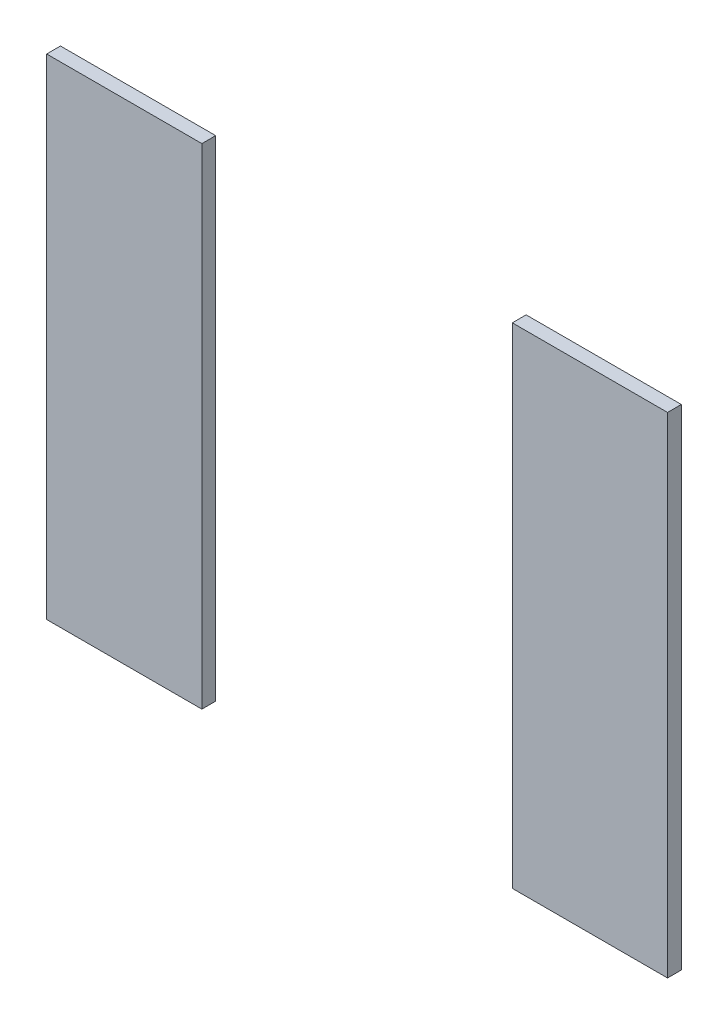
ISO-10303-21;
HEADER;
FILE_DESCRIPTION(('STEP AP214'),'2;1');
FILE_NAME('part.step','',(''),(''),'','','');
FILE_SCHEMA(('AUTOMOTIVE_DESIGN { 1 0 10303 214 1 1 1 1 }'));
ENDSEC;
DATA;
#1=APPLICATION_CONTEXT('core data for automotive mechanical design processes');
#2=APPLICATION_PROTOCOL_DEFINITION('international standard','automotive_design',2000,#1);
#3=PRODUCT_CONTEXT('',#1,'mechanical');
#4=PRODUCT('Part','Part','',(#3));
#5=PRODUCT_RELATED_PRODUCT_CATEGORY('part','',(#4));
#6=PRODUCT_DEFINITION_FORMATION('','',#4);
#7=PRODUCT_DEFINITION_CONTEXT('part definition',#1,'design');
#8=PRODUCT_DEFINITION('design','',#6,#7);
#9=PRODUCT_DEFINITION_SHAPE('','',#8);
#10=(LENGTH_UNIT() NAMED_UNIT(*) SI_UNIT(.MILLI.,.METRE.));
#11=(NAMED_UNIT(*) PLANE_ANGLE_UNIT() SI_UNIT($,.RADIAN.));
#12=(NAMED_UNIT(*) SI_UNIT($,.STERADIAN.) SOLID_ANGLE_UNIT());
#13=UNCERTAINTY_MEASURE_WITH_UNIT(LENGTH_MEASURE(1.E-05),#10,'distance_accuracy_value','');
#14=(GEOMETRIC_REPRESENTATION_CONTEXT(3) GLOBAL_UNCERTAINTY_ASSIGNED_CONTEXT((#13)) GLOBAL_UNIT_ASSIGNED_CONTEXT((#10,
#11,#12)) REPRESENTATION_CONTEXT('',''));
#15=CARTESIAN_POINT('',(0.,0.,0.));
#16=DIRECTION('',(0.,0.,1.));
#17=DIRECTION('',(1.,0.,0.));
#18=AXIS2_PLACEMENT_3D('',#15,#16,#17);
#19=CARTESIAN_POINT('',(225.,0.,10.));
#20=DIRECTION('',(-1.,0.,0.));
#21=DIRECTION('',(0.,0.,1.));
#22=AXIS2_PLACEMENT_3D('',#19,#20,#21);
#23=PLANE('',#22);
#24=DIRECTION('',(0.,1.,0.));
#25=VECTOR('',#24,1.);
#26=CARTESIAN_POINT('',(225.,0.,-10.));
#27=LINE('',#26,#25);
#28=CARTESIAN_POINT('',(225.,-710.,-10.));
#29=VERTEX_POINT('',#28);
#30=CARTESIAN_POINT('',(225.,0.,-10.));
#31=VERTEX_POINT('',#30);
#32=EDGE_CURVE('E108',#29,#31,#27,.T.);
#33=ORIENTED_EDGE('',*,*,#32,.F.);
#34=DIRECTION('',(0.,0.,-1.));
#35=VECTOR('',#34,1.);
#36=CARTESIAN_POINT('',(225.,-710.,10.));
#37=LINE('',#36,#35);
#38=CARTESIAN_POINT('',(225.,-710.,10.));
#39=VERTEX_POINT('',#38);
#40=EDGE_CURVE('E12',#39,#29,#37,.T.);
#41=ORIENTED_EDGE('',*,*,#40,.F.);
#42=DIRECTION('',(0.,1.,0.));
#43=VECTOR('',#42,1.);
#44=CARTESIAN_POINT('',(225.,0.,10.));
#45=LINE('',#44,#43);
#46=CARTESIAN_POINT('',(225.,0.,10.));
#47=VERTEX_POINT('',#46);
#48=EDGE_CURVE('E93',#39,#47,#45,.T.);
#49=ORIENTED_EDGE('',*,*,#48,.T.);
#50=DIRECTION('',(0.,0.,-1.));
#51=VECTOR('',#50,1.);
#52=CARTESIAN_POINT('',(225.,0.,10.));
#53=LINE('',#52,#51);
#54=EDGE_CURVE('E61',#47,#31,#53,.T.);
#55=ORIENTED_EDGE('',*,*,#54,.T.);
#56=EDGE_LOOP('',(#33,#41,#49,#55));
#57=FACE_BOUND('',#56,.T.);
#58=ADVANCED_FACE('F45',(#57),#23,.T.);
#59=CARTESIAN_POINT('',(0.,-710.,10.));
#60=DIRECTION('',(0.,1.,0.));
#61=DIRECTION('',(0.,0.,1.));
#62=AXIS2_PLACEMENT_3D('',#59,#60,#61);
#63=PLANE('',#62);
#64=DIRECTION('',(1.,0.,0.));
#65=VECTOR('',#64,1.);
#66=CARTESIAN_POINT('',(0.,-710.,-10.));
#67=LINE('',#66,#65);
#68=CARTESIAN_POINT('',(450.,-710.,-10.));
#69=VERTEX_POINT('',#68);
#70=EDGE_CURVE('E99',#29,#69,#67,.T.);
#71=ORIENTED_EDGE('',*,*,#70,.T.);
#72=DIRECTION('',(0.,0.,-1.));
#73=VECTOR('',#72,1.);
#74=CARTESIAN_POINT('',(450.,-710.,10.));
#75=LINE('',#74,#73);
#76=CARTESIAN_POINT('',(450.,-710.,10.));
#77=VERTEX_POINT('',#76);
#78=EDGE_CURVE('E53',#77,#69,#75,.T.);
#79=ORIENTED_EDGE('',*,*,#78,.F.);
#80=DIRECTION('',(1.,0.,0.));
#81=VECTOR('',#80,1.);
#82=CARTESIAN_POINT('',(0.,-710.,10.));
#83=LINE('',#82,#81);
#84=EDGE_CURVE('E87',#39,#77,#83,.T.);
#85=ORIENTED_EDGE('',*,*,#84,.F.);
#86=ORIENTED_EDGE('',*,*,#40,.T.);
#87=EDGE_LOOP('',(#71,#79,#85,#86));
#88=FACE_BOUND('',#87,.T.);
#89=ADVANCED_FACE('F97',(#88),#63,.F.);
#90=CARTESIAN_POINT('',(450.,0.,10.));
#91=DIRECTION('',(1.,0.,0.));
#92=DIRECTION('',(0.,1.,0.));
#93=AXIS2_PLACEMENT_3D('',#90,#91,#92);
#94=PLANE('',#93);
#95=DIRECTION('',(0.,-1.,0.));
#96=VECTOR('',#95,1.);
#97=CARTESIAN_POINT('',(450.,0.,-10.));
#98=LINE('',#97,#96);
#99=CARTESIAN_POINT('',(450.,0.,-10.));
#100=VERTEX_POINT('',#99);
#101=EDGE_CURVE('E111',#100,#69,#98,.T.);
#102=ORIENTED_EDGE('',*,*,#101,.F.);
#103=DIRECTION('',(0.,0.,-1.));
#104=VECTOR('',#103,1.);
#105=CARTESIAN_POINT('',(450.,0.,10.));
#106=LINE('',#105,#104);
#107=CARTESIAN_POINT('',(450.,0.,10.));
#108=VERTEX_POINT('',#107);
#109=EDGE_CURVE('E74',#108,#100,#106,.T.);
#110=ORIENTED_EDGE('',*,*,#109,.F.);
#111=DIRECTION('',(0.,-1.,0.));
#112=VECTOR('',#111,1.);
#113=CARTESIAN_POINT('',(450.,0.,10.));
#114=LINE('',#113,#112);
#115=EDGE_CURVE('E92',#108,#77,#114,.T.);
#116=ORIENTED_EDGE('',*,*,#115,.T.);
#117=ORIENTED_EDGE('',*,*,#78,.T.);
#118=EDGE_LOOP('',(#102,#110,#116,#117));
#119=FACE_BOUND('',#118,.T.);
#120=ADVANCED_FACE('F102',(#119),#94,.T.);
#121=CARTESIAN_POINT('',(0.,0.,10.));
#122=DIRECTION('',(0.,1.,0.));
#123=DIRECTION('',(0.,0.,1.));
#124=AXIS2_PLACEMENT_3D('',#121,#122,#123);
#125=PLANE('',#124);
#126=DIRECTION('',(1.,0.,0.));
#127=VECTOR('',#126,1.);
#128=CARTESIAN_POINT('',(0.,0.,-10.));
#129=LINE('',#128,#127);
#130=EDGE_CURVE('E113',#31,#100,#129,.T.);
#131=ORIENTED_EDGE('',*,*,#130,.F.);
#132=ORIENTED_EDGE('',*,*,#54,.F.);
#133=DIRECTION('',(1.,0.,0.));
#134=VECTOR('',#133,1.);
#135=CARTESIAN_POINT('',(0.,0.,10.));
#136=LINE('',#135,#134);
#137=EDGE_CURVE('E103',#47,#108,#136,.T.);
#138=ORIENTED_EDGE('',*,*,#137,.T.);
#139=ORIENTED_EDGE('',*,*,#109,.T.);
#140=EDGE_LOOP('',(#131,#132,#138,#139));
#141=FACE_BOUND('',#140,.T.);
#142=ADVANCED_FACE('F118',(#141),#125,.T.);
#143=CARTESIAN_POINT('',(0.,0.,10.));
#144=DIRECTION('',(0.,0.,1.));
#145=DIRECTION('',(1.,0.,0.));
#146=AXIS2_PLACEMENT_3D('',#143,#144,#145);
#147=PLANE('',#146);
#148=ORIENTED_EDGE('',*,*,#48,.F.);
#149=ORIENTED_EDGE('',*,*,#84,.T.);
#150=ORIENTED_EDGE('',*,*,#115,.F.);
#151=ORIENTED_EDGE('',*,*,#137,.F.);
#152=EDGE_LOOP('',(#148,#149,#150,#151));
#153=FACE_BOUND('',#152,.T.);
#154=ADVANCED_FACE('F89',(#153),#147,.T.);
#155=CARTESIAN_POINT('',(0.,0.,-10.));
#156=DIRECTION('',(0.,0.,1.));
#157=DIRECTION('',(1.,0.,0.));
#158=AXIS2_PLACEMENT_3D('',#155,#156,#157);
#159=PLANE('',#158);
#160=ORIENTED_EDGE('',*,*,#32,.T.);
#161=ORIENTED_EDGE('',*,*,#130,.T.);
#162=ORIENTED_EDGE('',*,*,#101,.T.);
#163=ORIENTED_EDGE('',*,*,#70,.F.);
#164=EDGE_LOOP('',(#160,#161,#162,#163));
#165=FACE_BOUND('',#164,.T.);
#166=ADVANCED_FACE('F125',(#165),#159,.F.);
#167=CLOSED_SHELL('',(#58,#89,#120,#142,#154,#166));
#168=MANIFOLD_SOLID_BREP('B2',#167);
#169=CARTESIAN_POINT('',(-450.,0.,10.));
#170=DIRECTION('',(1.,0.,0.));
#171=DIRECTION('',(0.,1.,0.));
#172=AXIS2_PLACEMENT_3D('',#169,#170,#171);
#173=PLANE('',#172);
#174=DIRECTION('',(0.,-1.,0.));
#175=VECTOR('',#174,1.);
#176=CARTESIAN_POINT('',(-450.,0.,-10.));
#177=LINE('',#176,#175);
#178=CARTESIAN_POINT('',(-450.,0.,-10.));
#179=VERTEX_POINT('',#178);
#180=CARTESIAN_POINT('',(-450.,-710.,-10.));
#181=VERTEX_POINT('',#180);
#182=EDGE_CURVE('E232',#179,#181,#177,.T.);
#183=ORIENTED_EDGE('',*,*,#182,.T.);
#184=DIRECTION('',(0.,0.,-1.));
#185=VECTOR('',#184,1.);
#186=CARTESIAN_POINT('',(-450.,-710.,10.));
#187=LINE('',#186,#185);
#188=CARTESIAN_POINT('',(-450.,-710.,10.));
#189=VERTEX_POINT('',#188);
#190=EDGE_CURVE('E43',#189,#181,#187,.T.);
#191=ORIENTED_EDGE('',*,*,#190,.F.);
#192=DIRECTION('',(0.,-1.,0.));
#193=VECTOR('',#192,1.);
#194=CARTESIAN_POINT('',(-450.,0.,10.));
#195=LINE('',#194,#193);
#196=CARTESIAN_POINT('',(-450.,0.,10.));
#197=VERTEX_POINT('',#196);
#198=EDGE_CURVE('E218',#197,#189,#195,.T.);
#199=ORIENTED_EDGE('',*,*,#198,.F.);
#200=DIRECTION('',(0.,0.,-1.));
#201=VECTOR('',#200,1.);
#202=CARTESIAN_POINT('',(-450.,0.,10.));
#203=LINE('',#202,#201);
#204=EDGE_CURVE('E185',#197,#179,#203,.T.);
#205=ORIENTED_EDGE('',*,*,#204,.T.);
#206=EDGE_LOOP('',(#183,#191,#199,#205));
#207=FACE_BOUND('',#206,.T.);
#208=ADVANCED_FACE('F169',(#207),#173,.F.);
#209=CARTESIAN_POINT('',(0.,-710.,10.));
#210=DIRECTION('',(0.,1.,0.));
#211=DIRECTION('',(0.,0.,1.));
#212=AXIS2_PLACEMENT_3D('',#209,#210,#211);
#213=PLANE('',#212);
#214=DIRECTION('',(1.,0.,0.));
#215=VECTOR('',#214,1.);
#216=CARTESIAN_POINT('',(0.,-710.,-10.));
#217=LINE('',#216,#215);
#218=CARTESIAN_POINT('',(-225.,-710.,-10.));
#219=VERTEX_POINT('',#218);
#220=EDGE_CURVE('E223',#181,#219,#217,.T.);
#221=ORIENTED_EDGE('',*,*,#220,.T.);
#222=DIRECTION('',(0.,0.,-1.));
#223=VECTOR('',#222,1.);
#224=CARTESIAN_POINT('',(-225.,-710.,10.));
#225=LINE('',#224,#223);
#226=CARTESIAN_POINT('',(-225.,-710.,10.));
#227=VERTEX_POINT('',#226);
#228=EDGE_CURVE('E177',#227,#219,#225,.T.);
#229=ORIENTED_EDGE('',*,*,#228,.F.);
#230=DIRECTION('',(1.,0.,0.));
#231=VECTOR('',#230,1.);
#232=CARTESIAN_POINT('',(0.,-710.,10.));
#233=LINE('',#232,#231);
#234=EDGE_CURVE('E210',#189,#227,#233,.T.);
#235=ORIENTED_EDGE('',*,*,#234,.F.);
#236=ORIENTED_EDGE('',*,*,#190,.T.);
#237=EDGE_LOOP('',(#221,#229,#235,#236));
#238=FACE_BOUND('',#237,.T.);
#239=ADVANCED_FACE('F222',(#238),#213,.F.);
#240=CARTESIAN_POINT('',(-225.,0.,10.));
#241=DIRECTION('',(1.,0.,0.));
#242=DIRECTION('',(0.,0.,-1.));
#243=AXIS2_PLACEMENT_3D('',#240,#241,#242);
#244=PLANE('',#243);
#245=DIRECTION('',(0.,-1.,0.));
#246=VECTOR('',#245,1.);
#247=CARTESIAN_POINT('',(-225.,0.,-10.));
#248=LINE('',#247,#246);
#249=CARTESIAN_POINT('',(-225.,0.,-10.));
#250=VERTEX_POINT('',#249);
#251=EDGE_CURVE('E235',#250,#219,#248,.T.);
#252=ORIENTED_EDGE('',*,*,#251,.F.);
#253=DIRECTION('',(0.,0.,-1.));
#254=VECTOR('',#253,1.);
#255=CARTESIAN_POINT('',(-225.,0.,10.));
#256=LINE('',#255,#254);
#257=CARTESIAN_POINT('',(-225.,0.,10.));
#258=VERTEX_POINT('',#257);
#259=EDGE_CURVE('E199',#258,#250,#256,.T.);
#260=ORIENTED_EDGE('',*,*,#259,.F.);
#261=DIRECTION('',(0.,-1.,0.));
#262=VECTOR('',#261,1.);
#263=CARTESIAN_POINT('',(-225.,0.,10.));
#264=LINE('',#263,#262);
#265=EDGE_CURVE('E217',#258,#227,#264,.T.);
#266=ORIENTED_EDGE('',*,*,#265,.T.);
#267=ORIENTED_EDGE('',*,*,#228,.T.);
#268=EDGE_LOOP('',(#252,#260,#266,#267));
#269=FACE_BOUND('',#268,.T.);
#270=ADVANCED_FACE('F226',(#269),#244,.T.);
#271=CARTESIAN_POINT('',(0.,0.,10.));
#272=DIRECTION('',(0.,1.,0.));
#273=DIRECTION('',(0.,0.,1.));
#274=AXIS2_PLACEMENT_3D('',#271,#272,#273);
#275=PLANE('',#274);
#276=DIRECTION('',(1.,0.,0.));
#277=VECTOR('',#276,1.);
#278=CARTESIAN_POINT('',(0.,0.,-10.));
#279=LINE('',#278,#277);
#280=EDGE_CURVE('E237',#179,#250,#279,.T.);
#281=ORIENTED_EDGE('',*,*,#280,.F.);
#282=ORIENTED_EDGE('',*,*,#204,.F.);
#283=DIRECTION('',(1.,0.,0.));
#284=VECTOR('',#283,1.);
#285=CARTESIAN_POINT('',(0.,0.,10.));
#286=LINE('',#285,#284);
#287=EDGE_CURVE('E227',#197,#258,#286,.T.);
#288=ORIENTED_EDGE('',*,*,#287,.T.);
#289=ORIENTED_EDGE('',*,*,#259,.T.);
#290=EDGE_LOOP('',(#281,#282,#288,#289));
#291=FACE_BOUND('',#290,.T.);
#292=ADVANCED_FACE('F243',(#291),#275,.T.);
#293=CARTESIAN_POINT('',(0.,0.,10.));
#294=DIRECTION('',(0.,0.,1.));
#295=DIRECTION('',(1.,0.,0.));
#296=AXIS2_PLACEMENT_3D('',#293,#294,#295);
#297=PLANE('',#296);
#298=ORIENTED_EDGE('',*,*,#198,.T.);
#299=ORIENTED_EDGE('',*,*,#234,.T.);
#300=ORIENTED_EDGE('',*,*,#265,.F.);
#301=ORIENTED_EDGE('',*,*,#287,.F.);
#302=EDGE_LOOP('',(#298,#299,#300,#301));
#303=FACE_BOUND('',#302,.T.);
#304=ADVANCED_FACE('F214',(#303),#297,.T.);
#305=CARTESIAN_POINT('',(0.,0.,-10.));
#306=DIRECTION('',(0.,0.,1.));
#307=DIRECTION('',(1.,0.,0.));
#308=AXIS2_PLACEMENT_3D('',#305,#306,#307);
#309=PLANE('',#308);
#310=ORIENTED_EDGE('',*,*,#182,.F.);
#311=ORIENTED_EDGE('',*,*,#280,.T.);
#312=ORIENTED_EDGE('',*,*,#251,.T.);
#313=ORIENTED_EDGE('',*,*,#220,.F.);
#314=EDGE_LOOP('',(#310,#311,#312,#313));
#315=FACE_BOUND('',#314,.T.);
#316=ADVANCED_FACE('F242',(#315),#309,.F.);
#317=CLOSED_SHELL('',(#208,#239,#270,#292,#304,#316));
#318=MANIFOLD_SOLID_BREP('B6',#317);
#319=ADVANCED_BREP_SHAPE_REPRESENTATION('',(#18,#168,#318),#14);
#320=SHAPE_DEFINITION_REPRESENTATION(#9,#319);
ENDSEC;
END-ISO-10303-21;
